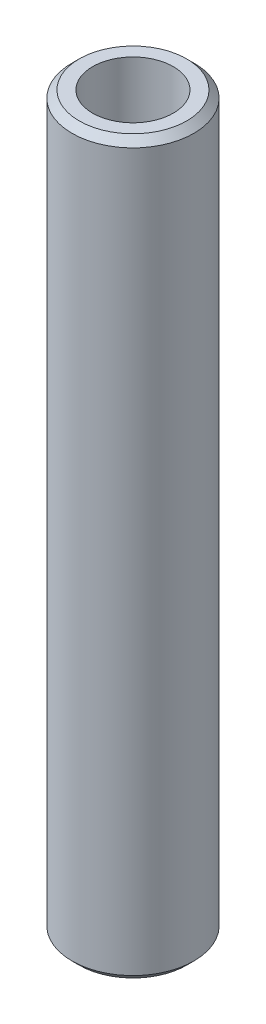
ISO-10303-21;
HEADER;
FILE_DESCRIPTION(('STEP AP214'),'2;1');
FILE_NAME('part.step','',(''),(''),'','','');
FILE_SCHEMA(('AUTOMOTIVE_DESIGN { 1 0 10303 214 1 1 1 1 }'));
ENDSEC;
DATA;
#1=APPLICATION_CONTEXT('core data for automotive mechanical design processes');
#2=APPLICATION_PROTOCOL_DEFINITION('international standard','automotive_design',2000,#1);
#3=PRODUCT_CONTEXT('',#1,'mechanical');
#4=PRODUCT('Part','Part','',(#3));
#5=PRODUCT_RELATED_PRODUCT_CATEGORY('part','',(#4));
#6=PRODUCT_DEFINITION_FORMATION('','',#4);
#7=PRODUCT_DEFINITION_CONTEXT('part definition',#1,'design');
#8=PRODUCT_DEFINITION('design','',#6,#7);
#9=PRODUCT_DEFINITION_SHAPE('','',#8);
#10=(LENGTH_UNIT() NAMED_UNIT(*) SI_UNIT(.MILLI.,.METRE.));
#11=(NAMED_UNIT(*) PLANE_ANGLE_UNIT() SI_UNIT($,.RADIAN.));
#12=(NAMED_UNIT(*) SI_UNIT($,.STERADIAN.) SOLID_ANGLE_UNIT());
#13=UNCERTAINTY_MEASURE_WITH_UNIT(LENGTH_MEASURE(1.E-05),#10,'distance_accuracy_value','');
#14=(GEOMETRIC_REPRESENTATION_CONTEXT(3) GLOBAL_UNCERTAINTY_ASSIGNED_CONTEXT((#13)) GLOBAL_UNIT_ASSIGNED_CONTEXT((#10,
#11,#12)) REPRESENTATION_CONTEXT('',''));
#15=CARTESIAN_POINT('',(0.,0.,0.));
#16=DIRECTION('',(0.,0.,1.));
#17=DIRECTION('',(1.,0.,0.));
#18=AXIS2_PLACEMENT_3D('',#15,#16,#17);
#19=CARTESIAN_POINT('',(0.,600.,0.));
#20=DIRECTION('',(0.,-1.,0.));
#21=DIRECTION('',(0.,0.,-1.));
#22=AXIS2_PLACEMENT_3D('',#19,#20,#21);
#23=CYLINDRICAL_SURFACE('',#22,50.);
#24=CARTESIAN_POINT('',(0.,594.119635828392,0.));
#25=DIRECTION('',(0.,1.,0.));
#26=DIRECTION('',(0.,0.,1.));
#27=AXIS2_PLACEMENT_3D('',#24,#25,#26);
#28=CIRCLE('',#27,50.);
#29=CARTESIAN_POINT('',(0.,594.119635828392,50.));
#30=VERTEX_POINT('',#29);
#31=EDGE_CURVE('E50',#30,#30,#28,.F.);
#32=ORIENTED_EDGE('',*,*,#31,.T.);
#33=EDGE_LOOP('',(#32));
#34=FACE_BOUND('',#33,.T.);
#35=CARTESIAN_POINT('',(0.,5.88036417160753,0.));
#36=DIRECTION('',(0.,1.,0.));
#37=DIRECTION('',(0.,0.,1.));
#38=AXIS2_PLACEMENT_3D('',#35,#36,#37);
#39=CIRCLE('',#38,50.);
#40=CARTESIAN_POINT('',(0.,5.88036417160753,50.));
#41=VERTEX_POINT('',#40);
#42=EDGE_CURVE('E51',#41,#41,#39,.T.);
#43=ORIENTED_EDGE('',*,*,#42,.T.);
#44=EDGE_LOOP('',(#43));
#45=FACE_BOUND('',#44,.T.);
#46=ADVANCED_FACE('F39',(#34,#45),#23,.T.);
#47=CARTESIAN_POINT('',(0.,600.,0.));
#48=DIRECTION('',(0.,1.,0.));
#49=DIRECTION('',(0.,0.,1.));
#50=AXIS2_PLACEMENT_3D('',#47,#48,#49);
#51=PLANE('',#50);
#52=CARTESIAN_POINT('',(0.,600.,0.));
#53=DIRECTION('',(0.,1.,0.));
#54=DIRECTION('',(0.,0.,1.));
#55=AXIS2_PLACEMENT_3D('',#52,#53,#54);
#56=CIRCLE('',#55,44.1196358283925);
#57=CARTESIAN_POINT('',(0.,600.,44.1196358283925));
#58=VERTEX_POINT('',#57);
#59=EDGE_CURVE('E54',#58,#58,#56,.T.);
#60=ORIENTED_EDGE('',*,*,#59,.T.);
#61=EDGE_LOOP('',(#60));
#62=FACE_BOUND('',#61,.T.);
#63=CARTESIAN_POINT('',(0.,600.,0.));
#64=DIRECTION('',(0.,1.,0.));
#65=DIRECTION('',(0.,0.,1.));
#66=AXIS2_PLACEMENT_3D('',#63,#64,#65);
#67=CIRCLE('',#66,33.1161259136719);
#68=CARTESIAN_POINT('',(0.,600.,33.1161259136719));
#69=VERTEX_POINT('',#68);
#70=EDGE_CURVE('E58',#69,#69,#67,.T.);
#71=ORIENTED_EDGE('',*,*,#70,.F.);
#72=EDGE_LOOP('',(#71));
#73=FACE_BOUND('',#72,.T.);
#74=ADVANCED_FACE('F69',(#62,#73),#51,.T.);
#75=CARTESIAN_POINT('',(0.,0.,0.));
#76=DIRECTION('',(0.,1.,0.));
#77=DIRECTION('',(0.,0.,1.));
#78=AXIS2_PLACEMENT_3D('',#75,#76,#77);
#79=PLANE('',#78);
#80=CARTESIAN_POINT('',(0.,0.,0.));
#81=DIRECTION('',(0.,1.,0.));
#82=DIRECTION('',(0.,0.,1.));
#83=AXIS2_PLACEMENT_3D('',#80,#81,#82);
#84=CIRCLE('',#83,44.1196358283924);
#85=CARTESIAN_POINT('',(0.,0.,44.1196358283924));
#86=VERTEX_POINT('',#85);
#87=EDGE_CURVE('E10',#86,#86,#84,.F.);
#88=ORIENTED_EDGE('',*,*,#87,.T.);
#89=EDGE_LOOP('',(#88));
#90=FACE_BOUND('',#89,.T.);
#91=CARTESIAN_POINT('',(0.,0.,0.));
#92=DIRECTION('',(0.,1.,0.));
#93=DIRECTION('',(0.,0.,1.));
#94=AXIS2_PLACEMENT_3D('',#91,#92,#93);
#95=CIRCLE('',#94,33.1161259136719);
#96=CARTESIAN_POINT('',(0.,0.,33.1161259136719));
#97=VERTEX_POINT('',#96);
#98=EDGE_CURVE('E63',#97,#97,#95,.T.);
#99=ORIENTED_EDGE('',*,*,#98,.T.);
#100=EDGE_LOOP('',(#99));
#101=FACE_BOUND('',#100,.T.);
#102=ADVANCED_FACE('F75',(#90,#101),#79,.F.);
#103=CARTESIAN_POINT('',(0.,600.,0.));
#104=DIRECTION('',(0.,-1.,0.));
#105=DIRECTION('',(0.,0.,-1.));
#106=AXIS2_PLACEMENT_3D('',#103,#104,#105);
#107=CYLINDRICAL_SURFACE('',#106,33.1161259136719);
#108=ORIENTED_EDGE('',*,*,#70,.T.);
#109=EDGE_LOOP('',(#108));
#110=FACE_BOUND('',#109,.T.);
#111=ORIENTED_EDGE('',*,*,#98,.F.);
#112=EDGE_LOOP('',(#111));
#113=FACE_BOUND('',#112,.T.);
#114=ADVANCED_FACE('F70',(#110,#113),#107,.F.);
#115=CARTESIAN_POINT('',(0.,600.,0.));
#116=DIRECTION('',(0.,-1.,0.));
#117=DIRECTION('',(0.,0.,-1.));
#118=AXIS2_PLACEMENT_3D('',#115,#116,#117);
#119=CONICAL_SURFACE('',#118,44.1196358283925,0.785398163397449);
#120=ORIENTED_EDGE('',*,*,#31,.F.);
#121=EDGE_LOOP('',(#120));
#122=FACE_BOUND('',#121,.T.);
#123=ORIENTED_EDGE('',*,*,#59,.F.);
#124=EDGE_LOOP('',(#123));
#125=FACE_BOUND('',#124,.T.);
#126=ADVANCED_FACE('F81',(#122,#125),#119,.T.);
#127=CARTESIAN_POINT('',(0.,5.88036417160753,0.));
#128=DIRECTION('',(0.,1.,0.));
#129=DIRECTION('',(0.,0.,1.));
#130=AXIS2_PLACEMENT_3D('',#127,#128,#129);
#131=CONICAL_SURFACE('',#130,50.,0.785398163397454);
#132=ORIENTED_EDGE('',*,*,#87,.F.);
#133=EDGE_LOOP('',(#132));
#134=FACE_BOUND('',#133,.T.);
#135=ORIENTED_EDGE('',*,*,#42,.F.);
#136=EDGE_LOOP('',(#135));
#137=FACE_BOUND('',#136,.T.);
#138=ADVANCED_FACE('F45',(#134,#137),#131,.T.);
#139=CLOSED_SHELL('',(#46,#74,#102,#114,#126,#138));
#140=MANIFOLD_SOLID_BREP('B2',#139);
#141=ADVANCED_BREP_SHAPE_REPRESENTATION('',(#18,#140),#14);
#142=SHAPE_DEFINITION_REPRESENTATION(#9,#141);
ENDSEC;
END-ISO-10303-21;
